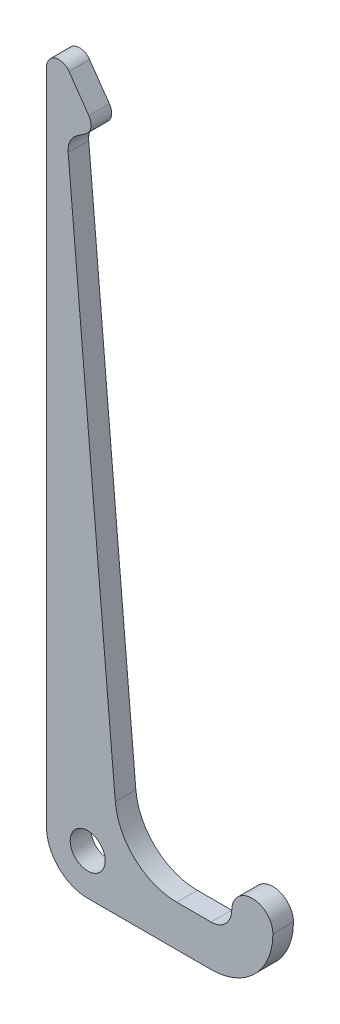
ISO-10303-21;
HEADER;
FILE_DESCRIPTION(('STEP AP214'),'2;1');
FILE_NAME('part.step','',(''),(''),'','','');
FILE_SCHEMA(('AUTOMOTIVE_DESIGN { 1 0 10303 214 1 1 1 1 }'));
ENDSEC;
DATA;
#1=APPLICATION_CONTEXT('core data for automotive mechanical design processes');
#2=APPLICATION_PROTOCOL_DEFINITION('international standard','automotive_design',2000,#1);
#3=PRODUCT_CONTEXT('',#1,'mechanical');
#4=PRODUCT('Part','Part','',(#3));
#5=PRODUCT_RELATED_PRODUCT_CATEGORY('part','',(#4));
#6=PRODUCT_DEFINITION_FORMATION('','',#4);
#7=PRODUCT_DEFINITION_CONTEXT('part definition',#1,'design');
#8=PRODUCT_DEFINITION('design','',#6,#7);
#9=PRODUCT_DEFINITION_SHAPE('','',#8);
#10=(LENGTH_UNIT() NAMED_UNIT(*) SI_UNIT(.MILLI.,.METRE.));
#11=(NAMED_UNIT(*) PLANE_ANGLE_UNIT() SI_UNIT($,.RADIAN.));
#12=(NAMED_UNIT(*) SI_UNIT($,.STERADIAN.) SOLID_ANGLE_UNIT());
#13=UNCERTAINTY_MEASURE_WITH_UNIT(LENGTH_MEASURE(1.E-05),#10,'distance_accuracy_value','');
#14=(GEOMETRIC_REPRESENTATION_CONTEXT(3) GLOBAL_UNCERTAINTY_ASSIGNED_CONTEXT((#13)) GLOBAL_UNIT_ASSIGNED_CONTEXT((#10,
#11,#12)) REPRESENTATION_CONTEXT('',''));
#15=CARTESIAN_POINT('',(0.,0.,0.));
#16=DIRECTION('',(0.,0.,1.));
#17=DIRECTION('',(1.,0.,0.));
#18=AXIS2_PLACEMENT_3D('',#15,#16,#17);
#19=CARTESIAN_POINT('',(0.,-51.7948717948716,5.));
#20=DIRECTION('',(0.,0.,1.));
#21=DIRECTION('',(1.,0.,0.));
#22=AXIS2_PLACEMENT_3D('',#19,#20,#21);
#23=PLANE('',#22);
#24=DIRECTION('',(1.,0.,0.));
#25=VECTOR('',#24,1.);
#26=CARTESIAN_POINT('',(0.,-61.7948717948716,5.));
#27=LINE('',#26,#25);
#28=CARTESIAN_POINT('',(0.,-61.7948717948716,5.));
#29=VERTEX_POINT('',#28);
#30=CARTESIAN_POINT('',(30.,-61.7948717948716,5.));
#31=VERTEX_POINT('',#30);
#32=EDGE_CURVE('E132',#29,#31,#27,.T.);
#33=ORIENTED_EDGE('',*,*,#32,.T.);
#34=CARTESIAN_POINT('',(30.,-46.7948717948716,5.));
#35=DIRECTION('',(0.,0.,1.));
#36=DIRECTION('',(1.,0.,0.));
#37=AXIS2_PLACEMENT_3D('',#34,#35,#36);
#38=CIRCLE('',#37,15.);
#39=CARTESIAN_POINT('',(45.,-46.7948717948716,5.));
#40=VERTEX_POINT('',#39);
#41=EDGE_CURVE('E11',#31,#40,#38,.T.);
#42=ORIENTED_EDGE('',*,*,#41,.T.);
#43=CARTESIAN_POINT('',(40.,-46.7948717948716,5.));
#44=DIRECTION('',(0.,0.,1.));
#45=DIRECTION('',(1.,0.,0.));
#46=AXIS2_PLACEMENT_3D('',#43,#44,#45);
#47=CIRCLE('',#46,5.);
#48=CARTESIAN_POINT('',(35.,-46.7948717948716,5.));
#49=VERTEX_POINT('',#48);
#50=EDGE_CURVE('E140',#40,#49,#47,.T.);
#51=ORIENTED_EDGE('',*,*,#50,.T.);
#52=CARTESIAN_POINT('',(30.,-46.7948717948716,5.));
#53=DIRECTION('',(0.,0.,1.));
#54=DIRECTION('',(1.,0.,0.));
#55=AXIS2_PLACEMENT_3D('',#52,#53,#54);
#56=CIRCLE('',#55,5.);
#57=CARTESIAN_POINT('',(30.,-51.7948717948716,5.));
#58=VERTEX_POINT('',#57);
#59=EDGE_CURVE('E167',#49,#58,#56,.F.);
#60=ORIENTED_EDGE('',*,*,#59,.T.);
#61=DIRECTION('',(-1.,0.,0.));
#62=VECTOR('',#61,1.);
#63=CARTESIAN_POINT('',(21.6474068688367,-51.7948717948716,5.));
#64=LINE('',#63,#62);
#65=CARTESIAN_POINT('',(21.6474068688367,-51.7948717948716,5.));
#66=VERTEX_POINT('',#65);
#67=EDGE_CURVE('E171',#58,#66,#64,.T.);
#68=ORIENTED_EDGE('',*,*,#67,.T.);
#69=CARTESIAN_POINT('',(21.6474068688366,-36.7948717948716,5.));
#70=DIRECTION('',(0.,0.,-1.));
#71=DIRECTION('',(-1.,0.,0.));
#72=AXIS2_PLACEMENT_3D('',#69,#70,#71);
#73=CIRCLE('',#72,15.);
#74=CARTESIAN_POINT('',(6.70448639746039,-38.1022079360864,5.));
#75=VERTEX_POINT('',#74);
#76=EDGE_CURVE('E184',#66,#75,#73,.T.);
#77=ORIENTED_EDGE('',*,*,#76,.T.);
#78=DIRECTION('',(-0.0871557427476584,0.996194698091745,0.));
#79=VECTOR('',#78,1.);
#80=CARTESIAN_POINT('',(-4.74840304231607,92.8049173783012,5.));
#81=LINE('',#80,#79);
#82=CARTESIAN_POINT('',(-4.74840304231607,92.8049173783012,5.));
#83=VERTEX_POINT('',#82);
#84=EDGE_CURVE('E257',#75,#83,#81,.T.);
#85=ORIENTED_EDGE('',*,*,#84,.T.);
#86=CARTESIAN_POINT('',(0.232570448142658,93.2406960920395,5.));
#87=DIRECTION('',(0.,0.,-1.));
#88=DIRECTION('',(1.,0.,0.));
#89=AXIS2_PLACEMENT_3D('',#86,#87,#88);
#90=CIRCLE('',#89,5.);
#91=CARTESIAN_POINT('',(-2.63531173361254,97.3364563134845,5.));
#92=VERTEX_POINT('',#91);
#93=EDGE_CURVE('E254',#83,#92,#90,.T.);
#94=ORIENTED_EDGE('',*,*,#93,.T.);
#95=DIRECTION('',(0.819152044288994,0.573576436351042,0.));
#96=VECTOR('',#95,1.);
#97=CARTESIAN_POINT('',(-0.457456132866976,98.8614072222588,5.));
#98=LINE('',#97,#96);
#99=CARTESIAN_POINT('',(-0.457456132866973,98.8614072222588,5.));
#100=VERTEX_POINT('',#99);
#101=EDGE_CURVE('E256',#92,#100,#98,.T.);
#102=ORIENTED_EDGE('',*,*,#101,.T.);
#103=CARTESIAN_POINT('',(-2.17818544192009,101.318863355126,5.));
#104=DIRECTION('',(0.,0.,1.));
#105=DIRECTION('',(-1.,0.,0.));
#106=AXIS2_PLACEMENT_3D('',#103,#104,#105);
#107=CIRCLE('',#106,3.);
#108=CARTESIAN_POINT('',(0.279270690946887,103.039592664179,5.));
#109=VERTEX_POINT('',#108);
#110=EDGE_CURVE('E259',#100,#109,#107,.T.);
#111=ORIENTED_EDGE('',*,*,#110,.T.);
#112=DIRECTION('',(-0.573576436351042,0.819152044288995,0.));
#113=VECTOR('',#112,1.);
#114=CARTESIAN_POINT('',(-4.542543867133,109.925857514181,5.));
#115=LINE('',#114,#113);
#116=CARTESIAN_POINT('',(-4.54254386713299,109.925857514181,5.));
#117=VERTEX_POINT('',#116);
#118=EDGE_CURVE('E265',#109,#117,#115,.T.);
#119=ORIENTED_EDGE('',*,*,#118,.T.);
#120=CARTESIAN_POINT('',(-6.99999999999998,108.205128205128,5.));
#121=DIRECTION('',(0.,0.,1.));
#122=DIRECTION('',(1.,0.,0.));
#123=AXIS2_PLACEMENT_3D('',#120,#121,#122);
#124=CIRCLE('',#123,3.00000000000001);
#125=CARTESIAN_POINT('',(-10.,108.205128205128,5.));
#126=VERTEX_POINT('',#125);
#127=EDGE_CURVE('E267',#117,#126,#124,.T.);
#128=ORIENTED_EDGE('',*,*,#127,.T.);
#129=DIRECTION('',(0.,-1.,0.));
#130=VECTOR('',#129,1.);
#131=CARTESIAN_POINT('',(-10.,-51.7948717948716,5.));
#132=LINE('',#131,#130);
#133=CARTESIAN_POINT('',(-10.,-51.7948717948716,5.));
#134=VERTEX_POINT('',#133);
#135=EDGE_CURVE('E146',#126,#134,#132,.T.);
#136=ORIENTED_EDGE('',*,*,#135,.T.);
#137=CARTESIAN_POINT('',(0.,-51.7948717948716,5.));
#138=DIRECTION('',(0.,0.,1.));
#139=DIRECTION('',(1.,0.,0.));
#140=AXIS2_PLACEMENT_3D('',#137,#138,#139);
#141=CIRCLE('',#140,10.);
#142=EDGE_CURVE('E141',#134,#29,#141,.T.);
#143=ORIENTED_EDGE('',*,*,#142,.T.);
#144=EDGE_LOOP('',(#33,#42,#51,#60,#68,#77,#85,#94,#102,#111,#119,#128,#136,#143));
#145=FACE_BOUND('',#144,.T.);
#146=CARTESIAN_POINT('',(0.,-51.7948717948716,5.));
#147=DIRECTION('',(0.,0.,1.));
#148=DIRECTION('',(1.,0.,0.));
#149=AXIS2_PLACEMENT_3D('',#146,#147,#148);
#150=CIRCLE('',#149,4.25);
#151=CARTESIAN_POINT('',(4.25,-51.7948717948716,5.));
#152=VERTEX_POINT('',#151);
#153=EDGE_CURVE('E269',#152,#152,#150,.T.);
#154=ORIENTED_EDGE('',*,*,#153,.F.);
#155=EDGE_LOOP('',(#154));
#156=FACE_BOUND('',#155,.T.);
#157=ADVANCED_FACE('F35',(#145,#156),#23,.T.);
#158=CARTESIAN_POINT('',(0.,-51.7948717948716,0.));
#159=DIRECTION('',(0.,0.,1.));
#160=DIRECTION('',(1.,0.,0.));
#161=AXIS2_PLACEMENT_3D('',#158,#159,#160);
#162=PLANE('',#161);
#163=CARTESIAN_POINT('',(40.,-46.7948717948716,0.));
#164=DIRECTION('',(0.,0.,1.));
#165=DIRECTION('',(1.,0.,0.));
#166=AXIS2_PLACEMENT_3D('',#163,#164,#165);
#167=CIRCLE('',#166,5.);
#168=CARTESIAN_POINT('',(45.,-46.7948717948716,0.));
#169=VERTEX_POINT('',#168);
#170=CARTESIAN_POINT('',(35.,-46.7948717948716,0.));
#171=VERTEX_POINT('',#170);
#172=EDGE_CURVE('E190',#169,#171,#167,.T.);
#173=ORIENTED_EDGE('',*,*,#172,.F.);
#174=CARTESIAN_POINT('',(30.,-46.7948717948716,0.));
#175=DIRECTION('',(0.,0.,1.));
#176=DIRECTION('',(1.,0.,0.));
#177=AXIS2_PLACEMENT_3D('',#174,#175,#176);
#178=CIRCLE('',#177,15.);
#179=CARTESIAN_POINT('',(30.,-61.7948717948716,0.));
#180=VERTEX_POINT('',#179);
#181=EDGE_CURVE('E57',#169,#180,#178,.F.);
#182=ORIENTED_EDGE('',*,*,#181,.T.);
#183=DIRECTION('',(1.,0.,0.));
#184=VECTOR('',#183,1.);
#185=CARTESIAN_POINT('',(0.,-61.7948717948716,0.));
#186=LINE('',#185,#184);
#187=CARTESIAN_POINT('',(0.,-61.7948717948716,0.));
#188=VERTEX_POINT('',#187);
#189=EDGE_CURVE('E196',#188,#180,#186,.T.);
#190=ORIENTED_EDGE('',*,*,#189,.F.);
#191=CARTESIAN_POINT('',(0.,-51.7948717948716,0.));
#192=DIRECTION('',(0.,0.,1.));
#193=DIRECTION('',(1.,0.,0.));
#194=AXIS2_PLACEMENT_3D('',#191,#192,#193);
#195=CIRCLE('',#194,10.);
#196=CARTESIAN_POINT('',(-10.,-51.7948717948716,0.));
#197=VERTEX_POINT('',#196);
#198=EDGE_CURVE('E154',#197,#188,#195,.T.);
#199=ORIENTED_EDGE('',*,*,#198,.F.);
#200=DIRECTION('',(0.,-1.,0.));
#201=VECTOR('',#200,1.);
#202=CARTESIAN_POINT('',(-10.,-51.7948717948716,0.));
#203=LINE('',#202,#201);
#204=CARTESIAN_POINT('',(-10.,108.205128205128,0.));
#205=VERTEX_POINT('',#204);
#206=EDGE_CURVE('E150',#205,#197,#203,.T.);
#207=ORIENTED_EDGE('',*,*,#206,.F.);
#208=CARTESIAN_POINT('',(-6.99999999999998,108.205128205128,0.));
#209=DIRECTION('',(0.,0.,1.));
#210=DIRECTION('',(1.,0.,0.));
#211=AXIS2_PLACEMENT_3D('',#208,#209,#210);
#212=CIRCLE('',#211,3.00000000000001);
#213=CARTESIAN_POINT('',(-4.54254386713299,109.925857514181,0.));
#214=VERTEX_POINT('',#213);
#215=EDGE_CURVE('E214',#214,#205,#212,.T.);
#216=ORIENTED_EDGE('',*,*,#215,.F.);
#217=DIRECTION('',(-0.573576436351042,0.819152044288995,0.));
#218=VECTOR('',#217,1.);
#219=CARTESIAN_POINT('',(-4.542543867133,109.925857514181,0.));
#220=LINE('',#219,#218);
#221=CARTESIAN_POINT('',(0.279270690946887,103.039592664179,0.));
#222=VERTEX_POINT('',#221);
#223=EDGE_CURVE('E212',#222,#214,#220,.T.);
#224=ORIENTED_EDGE('',*,*,#223,.F.);
#225=CARTESIAN_POINT('',(-2.17818544192009,101.318863355126,0.));
#226=DIRECTION('',(0.,0.,1.));
#227=DIRECTION('',(-1.,0.,0.));
#228=AXIS2_PLACEMENT_3D('',#225,#226,#227);
#229=CIRCLE('',#228,3.);
#230=CARTESIAN_POINT('',(-0.457456132866973,98.8614072222588,0.));
#231=VERTEX_POINT('',#230);
#232=EDGE_CURVE('E210',#231,#222,#229,.T.);
#233=ORIENTED_EDGE('',*,*,#232,.F.);
#234=DIRECTION('',(0.819152044288994,0.573576436351042,0.));
#235=VECTOR('',#234,1.);
#236=CARTESIAN_POINT('',(-0.457456132866976,98.8614072222588,0.));
#237=LINE('',#236,#235);
#238=CARTESIAN_POINT('',(-2.63531173361254,97.3364563134845,0.));
#239=VERTEX_POINT('',#238);
#240=EDGE_CURVE('E208',#239,#231,#237,.T.);
#241=ORIENTED_EDGE('',*,*,#240,.F.);
#242=CARTESIAN_POINT('',(0.232570448142658,93.2406960920395,0.));
#243=DIRECTION('',(0.,0.,-1.));
#244=DIRECTION('',(1.,0.,0.));
#245=AXIS2_PLACEMENT_3D('',#242,#243,#244);
#246=CIRCLE('',#245,5.);
#247=CARTESIAN_POINT('',(-4.74840304231607,92.8049173783012,0.));
#248=VERTEX_POINT('',#247);
#249=EDGE_CURVE('E206',#248,#239,#246,.T.);
#250=ORIENTED_EDGE('',*,*,#249,.F.);
#251=DIRECTION('',(-0.0871557427476584,0.996194698091745,0.));
#252=VECTOR('',#251,1.);
#253=CARTESIAN_POINT('',(-4.74840304231607,92.8049173783012,0.));
#254=LINE('',#253,#252);
#255=CARTESIAN_POINT('',(6.70448639746039,-38.1022079360864,0.));
#256=VERTEX_POINT('',#255);
#257=EDGE_CURVE('E204',#256,#248,#254,.T.);
#258=ORIENTED_EDGE('',*,*,#257,.F.);
#259=CARTESIAN_POINT('',(21.6474068688366,-36.7948717948716,0.));
#260=DIRECTION('',(0.,0.,-1.));
#261=DIRECTION('',(-1.,0.,0.));
#262=AXIS2_PLACEMENT_3D('',#259,#260,#261);
#263=CIRCLE('',#262,15.);
#264=CARTESIAN_POINT('',(21.6474068688367,-51.7948717948716,0.));
#265=VERTEX_POINT('',#264);
#266=EDGE_CURVE('E198',#265,#256,#263,.T.);
#267=ORIENTED_EDGE('',*,*,#266,.F.);
#268=DIRECTION('',(-1.,0.,0.));
#269=VECTOR('',#268,1.);
#270=CARTESIAN_POINT('',(21.6474068688367,-51.7948717948716,0.));
#271=LINE('',#270,#269);
#272=CARTESIAN_POINT('',(30.,-51.7948717948716,0.));
#273=VERTEX_POINT('',#272);
#274=EDGE_CURVE('E192',#273,#265,#271,.T.);
#275=ORIENTED_EDGE('',*,*,#274,.F.);
#276=CARTESIAN_POINT('',(30.,-46.7948717948716,0.));
#277=DIRECTION('',(0.,0.,1.));
#278=DIRECTION('',(1.,0.,0.));
#279=AXIS2_PLACEMENT_3D('',#276,#277,#278);
#280=CIRCLE('',#279,5.);
#281=EDGE_CURVE('E159',#273,#171,#280,.T.);
#282=ORIENTED_EDGE('',*,*,#281,.T.);
#283=EDGE_LOOP('',(#173,#182,#190,#199,#207,#216,#224,#233,#241,#250,#258,#267,#275,#282));
#284=FACE_BOUND('',#283,.T.);
#285=CARTESIAN_POINT('',(0.,-51.7948717948716,0.));
#286=DIRECTION('',(0.,0.,1.));
#287=DIRECTION('',(1.,0.,0.));
#288=AXIS2_PLACEMENT_3D('',#285,#286,#287);
#289=CIRCLE('',#288,4.25);
#290=CARTESIAN_POINT('',(4.25,-51.7948717948716,0.));
#291=VERTEX_POINT('',#290);
#292=EDGE_CURVE('E271',#291,#291,#289,.T.);
#293=ORIENTED_EDGE('',*,*,#292,.T.);
#294=EDGE_LOOP('',(#293));
#295=FACE_BOUND('',#294,.T.);
#296=ADVANCED_FACE('F188',(#284,#295),#162,.F.);
#297=CARTESIAN_POINT('',(0.,-51.7948717948716,5.));
#298=DIRECTION('',(0.,0.,-1.));
#299=DIRECTION('',(-1.,0.,0.));
#300=AXIS2_PLACEMENT_3D('',#297,#298,#299);
#301=CYLINDRICAL_SURFACE('',#300,10.);
#302=ORIENTED_EDGE('',*,*,#198,.T.);
#303=DIRECTION('',(0.,0.,-1.));
#304=VECTOR('',#303,1.);
#305=CARTESIAN_POINT('',(0.,-61.7948717948716,5.));
#306=LINE('',#305,#304);
#307=EDGE_CURVE('E136',#29,#188,#306,.T.);
#308=ORIENTED_EDGE('',*,*,#307,.F.);
#309=ORIENTED_EDGE('',*,*,#142,.F.);
#310=DIRECTION('',(0.,0.,-1.));
#311=VECTOR('',#310,1.);
#312=CARTESIAN_POINT('',(-10.,-51.7948717948716,5.));
#313=LINE('',#312,#311);
#314=EDGE_CURVE('E217',#134,#197,#313,.T.);
#315=ORIENTED_EDGE('',*,*,#314,.T.);
#316=EDGE_LOOP('',(#302,#308,#309,#315));
#317=FACE_BOUND('',#316,.T.);
#318=ADVANCED_FACE('F152',(#317),#301,.T.);
#319=CARTESIAN_POINT('',(0.,-61.7948717948716,5.));
#320=DIRECTION('',(0.,1.,0.));
#321=DIRECTION('',(-1.,0.,0.));
#322=AXIS2_PLACEMENT_3D('',#319,#320,#321);
#323=PLANE('',#322);
#324=ORIENTED_EDGE('',*,*,#189,.T.);
#325=DIRECTION('',(0.,0.,-1.));
#326=VECTOR('',#325,1.);
#327=CARTESIAN_POINT('',(30.,-61.7948717948716,5.));
#328=LINE('',#327,#326);
#329=EDGE_CURVE('E43',#180,#31,#328,.F.);
#330=ORIENTED_EDGE('',*,*,#329,.T.);
#331=ORIENTED_EDGE('',*,*,#32,.F.);
#332=ORIENTED_EDGE('',*,*,#307,.T.);
#333=EDGE_LOOP('',(#324,#330,#331,#332));
#334=FACE_BOUND('',#333,.T.);
#335=ADVANCED_FACE('F134',(#334),#323,.F.);
#336=CARTESIAN_POINT('',(40.,-46.7948717948716,5.));
#337=DIRECTION('',(0.,0.,-1.));
#338=DIRECTION('',(-1.,0.,0.));
#339=AXIS2_PLACEMENT_3D('',#336,#337,#338);
#340=CYLINDRICAL_SURFACE('',#339,5.);
#341=ORIENTED_EDGE('',*,*,#172,.T.);
#342=DIRECTION('',(0.,0.,-1.));
#343=VECTOR('',#342,1.);
#344=CARTESIAN_POINT('',(35.,-46.7948717948716,5.));
#345=LINE('',#344,#343);
#346=EDGE_CURVE('E162',#49,#171,#345,.T.);
#347=ORIENTED_EDGE('',*,*,#346,.F.);
#348=ORIENTED_EDGE('',*,*,#50,.F.);
#349=DIRECTION('',(0.,0.,-1.));
#350=VECTOR('',#349,1.);
#351=CARTESIAN_POINT('',(45.,-46.7948717948716,5.));
#352=LINE('',#351,#350);
#353=EDGE_CURVE('E156',#40,#169,#352,.T.);
#354=ORIENTED_EDGE('',*,*,#353,.T.);
#355=EDGE_LOOP('',(#341,#347,#348,#354));
#356=FACE_BOUND('',#355,.T.);
#357=ADVANCED_FACE('F194',(#356),#340,.T.);
#358=CARTESIAN_POINT('',(21.6474068688367,-51.7948717948716,5.));
#359=DIRECTION('',(0.,-1.,0.));
#360=DIRECTION('',(0.,0.,-1.));
#361=AXIS2_PLACEMENT_3D('',#358,#359,#360);
#362=PLANE('',#361);
#363=ORIENTED_EDGE('',*,*,#67,.F.);
#364=DIRECTION('',(0.,0.,-1.));
#365=VECTOR('',#364,1.);
#366=CARTESIAN_POINT('',(30.,-51.7948717948716,0.));
#367=LINE('',#366,#365);
#368=EDGE_CURVE('E155',#58,#273,#367,.T.);
#369=ORIENTED_EDGE('',*,*,#368,.T.);
#370=ORIENTED_EDGE('',*,*,#274,.T.);
#371=DIRECTION('',(0.,0.,-1.));
#372=VECTOR('',#371,1.);
#373=CARTESIAN_POINT('',(21.6474068688367,-51.7948717948716,5.));
#374=LINE('',#373,#372);
#375=EDGE_CURVE('E182',#66,#265,#374,.T.);
#376=ORIENTED_EDGE('',*,*,#375,.F.);
#377=EDGE_LOOP('',(#363,#369,#370,#376));
#378=FACE_BOUND('',#377,.T.);
#379=ADVANCED_FACE('F179',(#378),#362,.F.);
#380=CARTESIAN_POINT('',(21.6474068688366,-36.7948717948716,5.));
#381=DIRECTION('',(0.,0.,-1.));
#382=DIRECTION('',(-1.,0.,0.));
#383=AXIS2_PLACEMENT_3D('',#380,#381,#382);
#384=CYLINDRICAL_SURFACE('',#383,15.);
#385=ORIENTED_EDGE('',*,*,#266,.T.);
#386=DIRECTION('',(0.,0.,-1.));
#387=VECTOR('',#386,1.);
#388=CARTESIAN_POINT('',(6.70448639746039,-38.1022079360864,5.));
#389=LINE('',#388,#387);
#390=EDGE_CURVE('E237',#75,#256,#389,.T.);
#391=ORIENTED_EDGE('',*,*,#390,.F.);
#392=ORIENTED_EDGE('',*,*,#76,.F.);
#393=ORIENTED_EDGE('',*,*,#375,.T.);
#394=EDGE_LOOP('',(#385,#391,#392,#393));
#395=FACE_BOUND('',#394,.T.);
#396=ADVANCED_FACE('F241',(#395),#384,.F.);
#397=CARTESIAN_POINT('',(-4.74840304231607,92.8049173783012,5.));
#398=DIRECTION('',(-0.996194698091746,-0.0871557427476584,0.));
#399=DIRECTION('',(0.0871557427476584,-0.996194698091746,0.));
#400=AXIS2_PLACEMENT_3D('',#397,#398,#399);
#401=PLANE('',#400);
#402=ORIENTED_EDGE('',*,*,#257,.T.);
#403=DIRECTION('',(0.,0.,-1.));
#404=VECTOR('',#403,1.);
#405=CARTESIAN_POINT('',(-4.74840304231607,92.8049173783012,5.));
#406=LINE('',#405,#404);
#407=EDGE_CURVE('E234',#83,#248,#406,.T.);
#408=ORIENTED_EDGE('',*,*,#407,.F.);
#409=ORIENTED_EDGE('',*,*,#84,.F.);
#410=ORIENTED_EDGE('',*,*,#390,.T.);
#411=EDGE_LOOP('',(#402,#408,#409,#410));
#412=FACE_BOUND('',#411,.T.);
#413=ADVANCED_FACE('F248',(#412),#401,.F.);
#414=CARTESIAN_POINT('',(0.232570448142658,93.2406960920395,5.));
#415=DIRECTION('',(0.,0.,-1.));
#416=DIRECTION('',(-1.,0.,0.));
#417=AXIS2_PLACEMENT_3D('',#414,#415,#416);
#418=CYLINDRICAL_SURFACE('',#417,5.);
#419=ORIENTED_EDGE('',*,*,#249,.T.);
#420=DIRECTION('',(0.,0.,-1.));
#421=VECTOR('',#420,1.);
#422=CARTESIAN_POINT('',(-2.63531173361254,97.3364563134845,5.));
#423=LINE('',#422,#421);
#424=EDGE_CURVE('E231',#92,#239,#423,.T.);
#425=ORIENTED_EDGE('',*,*,#424,.F.);
#426=ORIENTED_EDGE('',*,*,#93,.F.);
#427=ORIENTED_EDGE('',*,*,#407,.T.);
#428=EDGE_LOOP('',(#419,#425,#426,#427));
#429=FACE_BOUND('',#428,.T.);
#430=ADVANCED_FACE('F252',(#429),#418,.F.);
#431=CARTESIAN_POINT('',(-0.457456132866976,98.8614072222588,5.));
#432=DIRECTION('',(-0.573576436351042,0.819152044288995,0.));
#433=DIRECTION('',(-0.819152044288995,-0.573576436351042,0.));
#434=AXIS2_PLACEMENT_3D('',#431,#432,#433);
#435=PLANE('',#434);
#436=ORIENTED_EDGE('',*,*,#240,.T.);
#437=DIRECTION('',(0.,0.,-1.));
#438=VECTOR('',#437,1.);
#439=CARTESIAN_POINT('',(-0.457456132866973,98.8614072222588,5.));
#440=LINE('',#439,#438);
#441=EDGE_CURVE('E228',#100,#231,#440,.T.);
#442=ORIENTED_EDGE('',*,*,#441,.F.);
#443=ORIENTED_EDGE('',*,*,#101,.F.);
#444=ORIENTED_EDGE('',*,*,#424,.T.);
#445=EDGE_LOOP('',(#436,#442,#443,#444));
#446=FACE_BOUND('',#445,.T.);
#447=ADVANCED_FACE('F308',(#446),#435,.F.);
#448=CARTESIAN_POINT('',(-2.17818544192009,101.318863355126,5.));
#449=DIRECTION('',(0.,0.,-1.));
#450=DIRECTION('',(-1.,0.,0.));
#451=AXIS2_PLACEMENT_3D('',#448,#449,#450);
#452=CYLINDRICAL_SURFACE('',#451,3.);
#453=ORIENTED_EDGE('',*,*,#232,.T.);
#454=DIRECTION('',(0.,0.,-1.));
#455=VECTOR('',#454,1.);
#456=CARTESIAN_POINT('',(0.279270690946887,103.039592664179,5.));
#457=LINE('',#456,#455);
#458=EDGE_CURVE('E225',#109,#222,#457,.T.);
#459=ORIENTED_EDGE('',*,*,#458,.F.);
#460=ORIENTED_EDGE('',*,*,#110,.F.);
#461=ORIENTED_EDGE('',*,*,#441,.T.);
#462=EDGE_LOOP('',(#453,#459,#460,#461));
#463=FACE_BOUND('',#462,.T.);
#464=ADVANCED_FACE('F304',(#463),#452,.T.);
#465=CARTESIAN_POINT('',(-4.542543867133,109.925857514181,5.));
#466=DIRECTION('',(-0.819152044288995,-0.573576436351042,0.));
#467=DIRECTION('',(0.573576436351042,-0.819152044288995,0.));
#468=AXIS2_PLACEMENT_3D('',#465,#466,#467);
#469=PLANE('',#468);
#470=ORIENTED_EDGE('',*,*,#223,.T.);
#471=DIRECTION('',(0.,0.,-1.));
#472=VECTOR('',#471,1.);
#473=CARTESIAN_POINT('',(-4.54254386713299,109.925857514181,5.));
#474=LINE('',#473,#472);
#475=EDGE_CURVE('E222',#117,#214,#474,.T.);
#476=ORIENTED_EDGE('',*,*,#475,.F.);
#477=ORIENTED_EDGE('',*,*,#118,.F.);
#478=ORIENTED_EDGE('',*,*,#458,.T.);
#479=EDGE_LOOP('',(#470,#476,#477,#478));
#480=FACE_BOUND('',#479,.T.);
#481=ADVANCED_FACE('F300',(#480),#469,.F.);
#482=CARTESIAN_POINT('',(-6.99999999999998,108.205128205128,5.));
#483=DIRECTION('',(0.,0.,-1.));
#484=DIRECTION('',(-1.,0.,0.));
#485=AXIS2_PLACEMENT_3D('',#482,#483,#484);
#486=CYLINDRICAL_SURFACE('',#485,3.00000000000001);
#487=ORIENTED_EDGE('',*,*,#215,.T.);
#488=DIRECTION('',(0.,0.,-1.));
#489=VECTOR('',#488,1.);
#490=CARTESIAN_POINT('',(-10.,108.205128205128,5.));
#491=LINE('',#490,#489);
#492=EDGE_CURVE('E219',#126,#205,#491,.T.);
#493=ORIENTED_EDGE('',*,*,#492,.F.);
#494=ORIENTED_EDGE('',*,*,#127,.F.);
#495=ORIENTED_EDGE('',*,*,#475,.T.);
#496=EDGE_LOOP('',(#487,#493,#494,#495));
#497=FACE_BOUND('',#496,.T.);
#498=ADVANCED_FACE('F288',(#497),#486,.T.);
#499=CARTESIAN_POINT('',(-10.,-51.7948717948716,5.));
#500=DIRECTION('',(1.,0.,0.));
#501=DIRECTION('',(0.,0.,-1.));
#502=AXIS2_PLACEMENT_3D('',#499,#500,#501);
#503=PLANE('',#502);
#504=ORIENTED_EDGE('',*,*,#206,.T.);
#505=ORIENTED_EDGE('',*,*,#314,.F.);
#506=ORIENTED_EDGE('',*,*,#135,.F.);
#507=ORIENTED_EDGE('',*,*,#492,.T.);
#508=EDGE_LOOP('',(#504,#505,#506,#507));
#509=FACE_BOUND('',#508,.T.);
#510=ADVANCED_FACE('F282',(#509),#503,.F.);
#511=CARTESIAN_POINT('',(0.,-51.7948717948716,5.));
#512=DIRECTION('',(0.,0.,-1.));
#513=DIRECTION('',(-1.,0.,0.));
#514=AXIS2_PLACEMENT_3D('',#511,#512,#513);
#515=CYLINDRICAL_SURFACE('',#514,4.25);
#516=ORIENTED_EDGE('',*,*,#153,.T.);
#517=EDGE_LOOP('',(#516));
#518=FACE_BOUND('',#517,.T.);
#519=ORIENTED_EDGE('',*,*,#292,.F.);
#520=EDGE_LOOP('',(#519));
#521=FACE_BOUND('',#520,.T.);
#522=ADVANCED_FACE('F280',(#518,#521),#515,.F.);
#523=CARTESIAN_POINT('',(30.,-46.7948717948716,5.));
#524=DIRECTION('',(0.,0.,1.));
#525=DIRECTION('',(1.,0.,0.));
#526=AXIS2_PLACEMENT_3D('',#523,#524,#525);
#527=CYLINDRICAL_SURFACE('',#526,5.);
#528=ORIENTED_EDGE('',*,*,#59,.F.);
#529=ORIENTED_EDGE('',*,*,#346,.T.);
#530=ORIENTED_EDGE('',*,*,#281,.F.);
#531=ORIENTED_EDGE('',*,*,#368,.F.);
#532=EDGE_LOOP('',(#528,#529,#530,#531));
#533=FACE_BOUND('',#532,.T.);
#534=ADVANCED_FACE('F186',(#533),#527,.F.);
#535=CARTESIAN_POINT('',(30.,-46.7948717948716,5.));
#536=DIRECTION('',(0.,0.,-1.));
#537=DIRECTION('',(-1.,0.,0.));
#538=AXIS2_PLACEMENT_3D('',#535,#536,#537);
#539=CYLINDRICAL_SURFACE('',#538,15.);
#540=ORIENTED_EDGE('',*,*,#41,.F.);
#541=ORIENTED_EDGE('',*,*,#329,.F.);
#542=ORIENTED_EDGE('',*,*,#181,.F.);
#543=ORIENTED_EDGE('',*,*,#353,.F.);
#544=EDGE_LOOP('',(#540,#541,#542,#543));
#545=FACE_BOUND('',#544,.T.);
#546=ADVANCED_FACE('F37',(#545),#539,.T.);
#547=CLOSED_SHELL('',(#157,#296,#318,#335,#357,#379,#396,#413,#430,#447,#464,#481,#498,#510,
#522,#534,#546));
#548=MANIFOLD_SOLID_BREP('B2',#547);
#549=ADVANCED_BREP_SHAPE_REPRESENTATION('',(#18,#548),#14);
#550=SHAPE_DEFINITION_REPRESENTATION(#9,#549);
ENDSEC;
END-ISO-10303-21;
